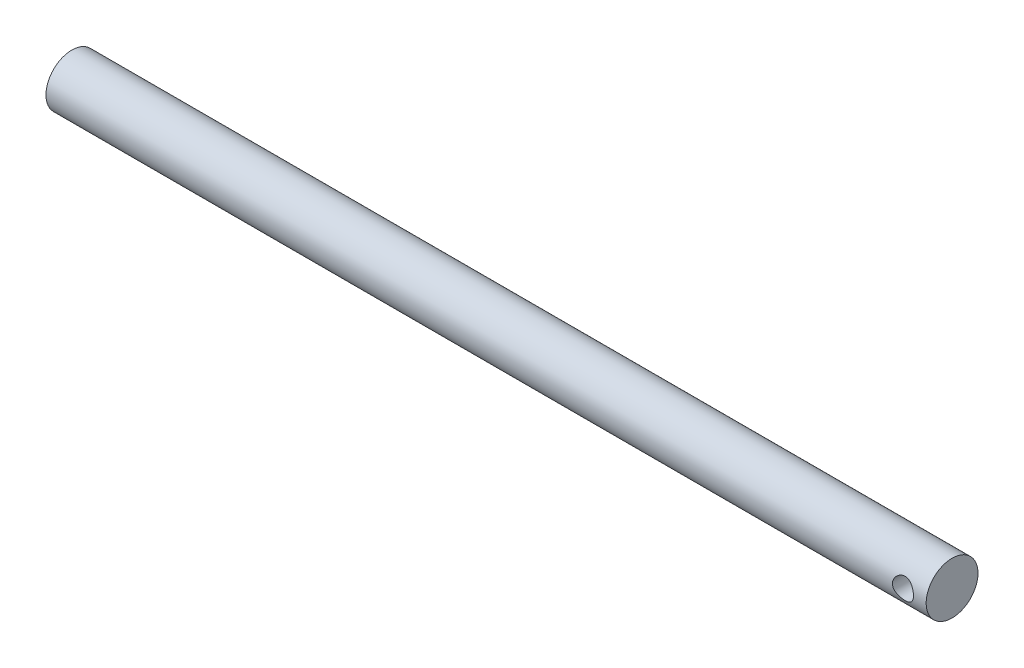
ISO-10303-21;
HEADER;
FILE_DESCRIPTION(('STEP AP214'),'2;1');
FILE_NAME('part.step','',(''),(''),'','','');
FILE_SCHEMA(('AUTOMOTIVE_DESIGN { 1 0 10303 214 1 1 1 1 }'));
ENDSEC;
DATA;
#1=APPLICATION_CONTEXT('core data for automotive mechanical design processes');
#2=APPLICATION_PROTOCOL_DEFINITION('international standard','automotive_design',2000,#1);
#3=PRODUCT_CONTEXT('',#1,'mechanical');
#4=PRODUCT('Part','Part','',(#3));
#5=PRODUCT_RELATED_PRODUCT_CATEGORY('part','',(#4));
#6=PRODUCT_DEFINITION_FORMATION('','',#4);
#7=PRODUCT_DEFINITION_CONTEXT('part definition',#1,'design');
#8=PRODUCT_DEFINITION('design','',#6,#7);
#9=PRODUCT_DEFINITION_SHAPE('','',#8);
#10=(LENGTH_UNIT() NAMED_UNIT(*) SI_UNIT(.MILLI.,.METRE.));
#11=(NAMED_UNIT(*) PLANE_ANGLE_UNIT() SI_UNIT($,.RADIAN.));
#12=(NAMED_UNIT(*) SI_UNIT($,.STERADIAN.) SOLID_ANGLE_UNIT());
#13=UNCERTAINTY_MEASURE_WITH_UNIT(LENGTH_MEASURE(1.E-05),#10,'distance_accuracy_value','');
#14=(GEOMETRIC_REPRESENTATION_CONTEXT(3) GLOBAL_UNCERTAINTY_ASSIGNED_CONTEXT((#13)) GLOBAL_UNIT_ASSIGNED_CONTEXT((#10,
#11,#12)) REPRESENTATION_CONTEXT('',''));
#15=CARTESIAN_POINT('',(0.,0.,0.));
#16=DIRECTION('',(0.,0.,1.));
#17=DIRECTION('',(1.,0.,0.));
#18=AXIS2_PLACEMENT_3D('',#15,#16,#17);
#19=CARTESIAN_POINT('',(336.55,0.,0.));
#20=DIRECTION('',(-1.,0.,0.));
#21=DIRECTION('',(0.,0.,1.));
#22=AXIS2_PLACEMENT_3D('',#19,#20,#21);
#23=CYLINDRICAL_SURFACE('',#22,9.90600000000003);
#24=CARTESIAN_POINT('',(331.6732,0.,-9.90600000000003));
#25=CARTESIAN_POINT('',(331.67319931171,0.107785756959739,-9.90599946720329));
#26=CARTESIAN_POINT('',(331.668851451565,0.215611870515692,-9.90423579157192));
#27=CARTESIAN_POINT('',(331.651500970418,0.430498103773549,-9.89722592009933));
#28=CARTESIAN_POINT('',(331.638492661224,0.537557673266086,-9.89197743543792));
#29=CARTESIAN_POINT('',(331.603912140248,0.750308446576703,-9.87811980477576));
#30=CARTESIAN_POINT('',(331.582321808404,0.855996263352754,-9.86950354871644));
#31=CARTESIAN_POINT('',(331.530801737637,1.06502491641378,-9.84914299845182));
#32=CARTESIAN_POINT('',(331.500868590722,1.16836477487382,-9.83739742602482));
#33=CARTESIAN_POINT('',(331.399197066726,1.47302518275353,-9.79799422248342));
#34=CARTESIAN_POINT('',(331.315430012255,1.66993495987736,-9.76610432932145));
#35=CARTESIAN_POINT('',(331.118658573489,2.04662803539722,-9.69417581812195));
#36=CARTESIAN_POINT('',(331.005663942857,2.22641701991603,-9.65413991947297));
#37=CARTESIAN_POINT('',(330.747907081554,2.57278567510446,-9.56780210647265));
#38=CARTESIAN_POINT('',(330.601969364299,2.73844075181738,-9.5213024412835));
#39=CARTESIAN_POINT('',(330.284827719943,3.04376186953679,-9.42814285118761));
#40=CARTESIAN_POINT('',(330.113611226987,3.18341490664399,-9.38148285791534));
#41=CARTESIAN_POINT('',(329.836688615126,3.3735969667962,-9.31410214580077));
#42=CARTESIAN_POINT('',(329.738636213966,3.43488760267198,-9.29161454179024));
#43=CARTESIAN_POINT('',(329.537284499471,3.54893572576803,-9.24865394929793));
#44=CARTESIAN_POINT('',(329.433987337233,3.60169667480695,-9.22818014483275));
#45=CARTESIAN_POINT('',(329.222792875433,3.69823447374518,-9.18991827098578));
#46=CARTESIAN_POINT('',(329.114895313452,3.74201081030794,-9.17213035507779));
#47=CARTESIAN_POINT('',(328.895306931957,3.82012571624854,-9.13987213388656));
#48=CARTESIAN_POINT('',(328.783618059778,3.85446905069886,-9.12540015417601));
#49=CARTESIAN_POINT('',(328.562446586724,3.91200940417058,-9.10087643989762));
#50=CARTESIAN_POINT('',(328.453097090242,3.93564475341129,-9.09065266580651));
#51=CARTESIAN_POINT('',(328.232565240865,3.97372079393312,-9.07407360908879));
#52=CARTESIAN_POINT('',(328.121383745134,3.98816566662676,-9.06771656726399));
#53=CARTESIAN_POINT('',(327.898067630786,4.00769981082608,-9.0591000111124));
#54=CARTESIAN_POINT('',(327.785933232388,4.01279118789037,-9.05683957460331));
#55=CARTESIAN_POINT('',(327.561630241576,4.01356148408144,-9.05649824006831));
#56=CARTESIAN_POINT('',(327.449461651079,4.00924085892323,-9.05841713968521));
#57=CARTESIAN_POINT('',(327.234073913478,3.99188878245661,-9.06607648204063));
#58=CARTESIAN_POINT('',(327.130791938782,3.9795069739982,-9.07153179745087));
#59=CARTESIAN_POINT('',(326.925714701338,3.94682140051344,-9.08579902222306));
#60=CARTESIAN_POINT('',(326.82391993843,3.9265150328825,-9.09461203430601));
#61=CARTESIAN_POINT('',(326.521855078954,3.85398295902639,-9.12570536256177));
#62=CARTESIAN_POINT('',(326.324723105224,3.79012932250168,-9.1526471296321));
#63=CARTESIAN_POINT('',(325.940069875939,3.63205557703205,-9.21652583125494));
#64=CARTESIAN_POINT('',(325.752831822534,3.53723456851028,-9.25365801715408));
#65=CARTESIAN_POINT('',(325.396195360218,3.32032204615302,-9.33368340821763));
#66=CARTESIAN_POINT('',(325.226803794326,3.19822012738186,-9.3765788089763));
#67=CARTESIAN_POINT('',(324.896537913437,2.91881447578817,-9.46744812035552));
#68=CARTESIAN_POINT('',(324.737410577375,2.7594842428423,-9.51555469917645));
#69=CARTESIAN_POINT('',(324.447564782867,2.41589686686986,-9.60853415127186));
#70=CARTESIAN_POINT('',(324.316852276572,2.23163451431844,-9.65340634571571));
#71=CARTESIAN_POINT('',(324.085177172906,1.83835332411109,-9.73603814067452));
#72=CARTESIAN_POINT('',(323.984887757494,1.62890032461179,-9.7736309388229));
#73=CARTESIAN_POINT('',(323.821572385602,1.19418590332827,-9.83620150008416));
#74=CARTESIAN_POINT('',(323.758526994021,0.968932795315464,-9.86118584169164));
#75=CARTESIAN_POINT('',(323.675058758445,0.523637120401855,-9.89451636722914));
#76=CARTESIAN_POINT('',(323.652290026871,0.304102530164374,-9.90377692692336));
#77=CARTESIAN_POINT('',(323.643074164198,-0.135825642678438,-9.90750841536815));
#78=CARTESIAN_POINT('',(323.656617316224,-0.356218979727653,-9.90198330069053));
#79=CARTESIAN_POINT('',(323.717929366506,-0.780868701339029,-9.87736123873587));
#80=CARTESIAN_POINT('',(323.764082986244,-0.985399579445305,-9.85890514422631));
#81=CARTESIAN_POINT('',(323.887092746533,-1.38361526293697,-9.81094774511991));
#82=CARTESIAN_POINT('',(323.963952813345,-1.57729867770586,-9.78144502808385));
#83=CARTESIAN_POINT('',(324.148705152098,-1.95503187616615,-9.71311883989844));
#84=CARTESIAN_POINT('',(324.257479337809,-2.13860199966074,-9.67403655250454));
#85=CARTESIAN_POINT('',(324.501996859352,-2.4855329922058,-9.59076865335602));
#86=CARTESIAN_POINT('',(324.637751153299,-2.64888560591668,-9.54658097108092));
#87=CARTESIAN_POINT('',(324.943144291843,-2.96235130163491,-9.45419481543783));
#88=CARTESIAN_POINT('',(325.114454759165,-3.1108197399243,-9.40592731612052));
#89=CARTESIAN_POINT('',(325.480388049249,-3.37732224960161,-9.31356406477619));
#90=CARTESIAN_POINT('',(325.675015125368,-3.49535075579504,-9.26946907652203));
#91=CARTESIAN_POINT('',(326.085309577407,-3.6985226275359,-9.19031240804444));
#92=CARTESIAN_POINT('',(326.301185065628,-3.78328951157574,-9.15535556038279));
#93=CARTESIAN_POINT('',(326.745995193962,-3.91459250383762,-9.09999862201889));
#94=CARTESIAN_POINT('',(326.974919712144,-3.96115782420201,-9.07958741006677));
#95=CARTESIAN_POINT('',(327.421192405149,-4.01191048954943,-9.05726822382088));
#96=CARTESIAN_POINT('',(327.638154205866,-4.01896190763851,-9.05411015743305));
#97=CARTESIAN_POINT('',(328.070022583305,-3.99804599712991,-9.06336561196016));
#98=CARTESIAN_POINT('',(328.284929432634,-3.97008338021767,-9.07577703775709));
#99=CARTESIAN_POINT('',(328.697408805736,-3.88229237250027,-9.11365805761341));
#100=CARTESIAN_POINT('',(328.895330520964,-3.82383844320487,-9.13856276592451));
#101=CARTESIAN_POINT('',(329.278625867465,-3.67802998473744,-9.19821214368756));
#102=CARTESIAN_POINT('',(329.463995996869,-3.59066742981208,-9.23295954532982));
#103=CARTESIAN_POINT('',(329.828685873396,-3.38364511919757,-9.31088962460299));
#104=CARTESIAN_POINT('',(330.007026344688,-3.26240218487819,-9.35444541834091));
#105=CARTESIAN_POINT('',(330.341714212323,-2.99338436919222,-9.44397149902089));
#106=CARTESIAN_POINT('',(330.498054642462,-2.84560111753074,-9.4899425444407));
#107=CARTESIAN_POINT('',(330.795175685481,-2.51572436591324,-9.58285586359443));
#108=CARTESIAN_POINT('',(330.934203459536,-2.33199210470509,-9.62965563356925));
#109=CARTESIAN_POINT('',(331.118071364304,-2.03981169714628,-9.69422721354448));
#110=CARTESIAN_POINT('',(331.175285378694,-1.93956495451881,-9.71482773338469));
#111=CARTESIAN_POINT('',(331.281022263686,-1.73415389893717,-9.75358601328541));
#112=CARTESIAN_POINT('',(331.329549124724,-1.62899187195536,-9.77174489395188));
#113=CARTESIAN_POINT('',(331.416688178499,-1.4163488961477,-9.80480349958568));
#114=CARTESIAN_POINT('',(331.455459489849,-1.30894108037842,-9.81975484973521));
#115=CARTESIAN_POINT('',(331.523780159846,-1.09088077880231,-9.84636319762273));
#116=CARTESIAN_POINT('',(331.553333863664,-0.9802298487895,-9.85802174733767));
#117=CARTESIAN_POINT('',(331.602856641398,-0.756783507401889,-9.87768520027674));
#118=CARTESIAN_POINT('',(331.622849665359,-0.643994198346997,-9.88569923073193));
#119=CARTESIAN_POINT('',(331.653119848625,-0.416970490890536,-9.89787218473156));
#120=CARTESIAN_POINT('',(331.663404295381,-0.302737241716623,-9.9020339997799));
#121=CARTESIAN_POINT('',(331.670253723842,-0.156928457497694,-9.90480674101653));
#122=CARTESIAN_POINT('',(331.671358314545,-0.12555560156652,-9.90525400445475));
#123=CARTESIAN_POINT('',(331.672831553009,-0.0627896384848647,-9.90585071160168));
#124=CARTESIAN_POINT('',(331.67320020049,-0.0313965313266424,-9.9060001551965));
#125=CARTESIAN_POINT('',(331.6732,0.,-9.90600000000003));
#126=B_SPLINE_CURVE_WITH_KNOTS('',3,(#24,#25,#26,#27,#28,#29,#30,#31,#32,#33,#34,#35,#36,#37,
#38,#39,#40,#41,#42,#43,#44,#45,#46,#47,#48,#49,#50,#51,#52,#53,#54,#55,#56,#57,#58,#59,#60,#61,
#62,#63,#64,#65,#66,#67,#68,#69,#70,#71,#72,#73,#74,#75,#76,#77,#78,#79,#80,#81,#82,#83,#84,#85,
#86,#87,#88,#89,#90,#91,#92,#93,#94,#95,#96,#97,#98,#99,#100,#101,#102,#103,#104,#105,#106,#107,
#108,#109,#110,#111,#112,#113,#114,#115,#116,#117,#118,#119,#120,#121,#122,#123,#124,#125),
.UNSPECIFIED.,.T.,.F.,(4,2,2,2,2,2,2,2,2,2,2,2,2,2,2,2,2,2,2,2,2,2,2,2,2,2,2,2,2,2,2,2,2,2,2,2,
2,2,2,2,2,2,2,2,2,2,2,2,2,2,4),(0.,0.323324929337709,0.646862428612577,0.971086704004783,
1.29544361781662,1.94130357069394,2.5869482682569,3.26089698176682,3.93518184422503,
4.28820918418762,4.64109288447482,4.99399674119123,5.34672199960586,5.68329821963634,
6.01972119708942,6.35606843332646,6.69239938449777,7.00451215592509,7.31672751863246,
7.94061881623197,8.5774173328727,9.21445914024528,9.90213248023218,10.5899497309485,
11.2920312001964,11.9937459769257,12.6530474041646,13.3121724233132,13.9407503393953,
14.5694086539382,15.217406563544,15.8656682008133,16.5578104588939,17.2500791686382,
17.9499718771549,18.649328888415,19.297266440613,19.9451168120598,20.5660079998404,
21.1870717072781,21.8442644699065,22.5016648633775,23.2032643238388,23.5546445570428,
23.9058629675241,24.2509148181572,24.5958037650251,24.9398241598601,25.2835861203166,
25.3777662576236,25.4719464309504),.UNSPECIFIED.);
#127=CARTESIAN_POINT('',(331.6732,0.,-9.90600000000003));
#128=VERTEX_POINT('',#127);
#129=EDGE_CURVE('E10',#128,#128,#126,.T.);
#130=ORIENTED_EDGE('',*,*,#129,.T.);
#131=EDGE_LOOP('',(#130));
#132=FACE_BOUND('',#131,.T.);
#133=CARTESIAN_POINT('',(331.6732,0.,9.90600000000003));
#134=CARTESIAN_POINT('',(331.67319931171,-0.107785756959739,9.90599946720329));
#135=CARTESIAN_POINT('',(331.668851451565,-0.215611870515692,9.90423579157192));
#136=CARTESIAN_POINT('',(331.651500970418,-0.430498103773549,9.89722592009933));
#137=CARTESIAN_POINT('',(331.638492661224,-0.537557673266086,9.89197743543792));
#138=CARTESIAN_POINT('',(331.603912140248,-0.750308446576703,9.87811980477576));
#139=CARTESIAN_POINT('',(331.582321808404,-0.855996263352754,9.86950354871644));
#140=CARTESIAN_POINT('',(331.530801737637,-1.06502491641378,9.84914299845182));
#141=CARTESIAN_POINT('',(331.500868590722,-1.16836477487382,9.83739742602482));
#142=CARTESIAN_POINT('',(331.399197066726,-1.47302518275353,9.79799422248342));
#143=CARTESIAN_POINT('',(331.315430012255,-1.66993495987736,9.76610432932145));
#144=CARTESIAN_POINT('',(331.118658573489,-2.04662803539722,9.69417581812195));
#145=CARTESIAN_POINT('',(331.005663942857,-2.22641701991603,9.65413991947297));
#146=CARTESIAN_POINT('',(330.747907081554,-2.57278567510446,9.56780210647265));
#147=CARTESIAN_POINT('',(330.601969364299,-2.73844075181738,9.5213024412835));
#148=CARTESIAN_POINT('',(330.284827719943,-3.04376186953679,9.42814285118761));
#149=CARTESIAN_POINT('',(330.113611226987,-3.18341490664399,9.38148285791534));
#150=CARTESIAN_POINT('',(329.836688615126,-3.3735969667962,9.31410214580077));
#151=CARTESIAN_POINT('',(329.738636213966,-3.43488760267198,9.29161454179024));
#152=CARTESIAN_POINT('',(329.537284499471,-3.54893572576803,9.24865394929793));
#153=CARTESIAN_POINT('',(329.433987337233,-3.60169667480695,9.22818014483275));
#154=CARTESIAN_POINT('',(329.222792875433,-3.69823447374518,9.18991827098578));
#155=CARTESIAN_POINT('',(329.114895313452,-3.74201081030794,9.17213035507779));
#156=CARTESIAN_POINT('',(328.895306931957,-3.82012571624854,9.13987213388656));
#157=CARTESIAN_POINT('',(328.783618059778,-3.85446905069886,9.12540015417601));
#158=CARTESIAN_POINT('',(328.562446586724,-3.91200940417058,9.10087643989762));
#159=CARTESIAN_POINT('',(328.453097090242,-3.93564475341129,9.09065266580651));
#160=CARTESIAN_POINT('',(328.232565240865,-3.97372079393312,9.07407360908879));
#161=CARTESIAN_POINT('',(328.121383745134,-3.98816566662676,9.06771656726399));
#162=CARTESIAN_POINT('',(327.898067630786,-4.00769981082608,9.0591000111124));
#163=CARTESIAN_POINT('',(327.785933232388,-4.01279118789037,9.05683957460331));
#164=CARTESIAN_POINT('',(327.561630241576,-4.01356148408144,9.05649824006831));
#165=CARTESIAN_POINT('',(327.449461651079,-4.00924085892323,9.05841713968521));
#166=CARTESIAN_POINT('',(327.234073913478,-3.99188878245661,9.06607648204063));
#167=CARTESIAN_POINT('',(327.130791938782,-3.9795069739982,9.07153179745087));
#168=CARTESIAN_POINT('',(326.925714701338,-3.94682140051344,9.08579902222306));
#169=CARTESIAN_POINT('',(326.82391993843,-3.9265150328825,9.09461203430601));
#170=CARTESIAN_POINT('',(326.521855078954,-3.85398295902639,9.12570536256177));
#171=CARTESIAN_POINT('',(326.324723105224,-3.79012932250168,9.1526471296321));
#172=CARTESIAN_POINT('',(325.940069875939,-3.63205557703205,9.21652583125494));
#173=CARTESIAN_POINT('',(325.752831822534,-3.53723456851028,9.25365801715408));
#174=CARTESIAN_POINT('',(325.396195360218,-3.32032204615302,9.33368340821763));
#175=CARTESIAN_POINT('',(325.226803794326,-3.19822012738186,9.3765788089763));
#176=CARTESIAN_POINT('',(324.896537913437,-2.91881447578817,9.46744812035552));
#177=CARTESIAN_POINT('',(324.737410577375,-2.7594842428423,9.51555469917645));
#178=CARTESIAN_POINT('',(324.447564782867,-2.41589686686986,9.60853415127186));
#179=CARTESIAN_POINT('',(324.316852276572,-2.23163451431844,9.65340634571571));
#180=CARTESIAN_POINT('',(324.085177172906,-1.83835332411109,9.73603814067452));
#181=CARTESIAN_POINT('',(323.984887757494,-1.62890032461179,9.7736309388229));
#182=CARTESIAN_POINT('',(323.821572385602,-1.19418590332827,9.83620150008416));
#183=CARTESIAN_POINT('',(323.758526994021,-0.968932795315464,9.86118584169164));
#184=CARTESIAN_POINT('',(323.675058758445,-0.523637120401855,9.89451636722914));
#185=CARTESIAN_POINT('',(323.652290026871,-0.304102530164374,9.90377692692336));
#186=CARTESIAN_POINT('',(323.643074164198,0.135825642678438,9.90750841536815));
#187=CARTESIAN_POINT('',(323.656617316224,0.356218979727653,9.90198330069053));
#188=CARTESIAN_POINT('',(323.717929366506,0.780868701339029,9.87736123873587));
#189=CARTESIAN_POINT('',(323.764082986244,0.985399579445305,9.85890514422631));
#190=CARTESIAN_POINT('',(323.887092746533,1.38361526293697,9.81094774511991));
#191=CARTESIAN_POINT('',(323.963952813345,1.57729867770586,9.78144502808385));
#192=CARTESIAN_POINT('',(324.148705152098,1.95503187616615,9.71311883989844));
#193=CARTESIAN_POINT('',(324.257479337809,2.13860199966074,9.67403655250454));
#194=CARTESIAN_POINT('',(324.501996859352,2.4855329922058,9.59076865335602));
#195=CARTESIAN_POINT('',(324.637751153299,2.64888560591668,9.54658097108092));
#196=CARTESIAN_POINT('',(324.943144291843,2.96235130163491,9.45419481543783));
#197=CARTESIAN_POINT('',(325.114454759165,3.1108197399243,9.40592731612052));
#198=CARTESIAN_POINT('',(325.480388049249,3.37732224960161,9.31356406477619));
#199=CARTESIAN_POINT('',(325.675015125368,3.49535075579504,9.26946907652203));
#200=CARTESIAN_POINT('',(326.085309577407,3.6985226275359,9.19031240804444));
#201=CARTESIAN_POINT('',(326.301185065628,3.78328951157574,9.15535556038279));
#202=CARTESIAN_POINT('',(326.745995193962,3.91459250383762,9.09999862201889));
#203=CARTESIAN_POINT('',(326.974919712144,3.96115782420201,9.07958741006677));
#204=CARTESIAN_POINT('',(327.421192405149,4.01191048954943,9.05726822382088));
#205=CARTESIAN_POINT('',(327.638154205866,4.01896190763851,9.05411015743305));
#206=CARTESIAN_POINT('',(328.070022583305,3.99804599712991,9.06336561196016));
#207=CARTESIAN_POINT('',(328.284929432634,3.97008338021767,9.07577703775709));
#208=CARTESIAN_POINT('',(328.697408805736,3.88229237250027,9.11365805761341));
#209=CARTESIAN_POINT('',(328.895330520964,3.82383844320487,9.13856276592451));
#210=CARTESIAN_POINT('',(329.278625867465,3.67802998473744,9.19821214368756));
#211=CARTESIAN_POINT('',(329.463995996869,3.59066742981208,9.23295954532982));
#212=CARTESIAN_POINT('',(329.828685873396,3.38364511919757,9.31088962460299));
#213=CARTESIAN_POINT('',(330.007026344688,3.26240218487819,9.35444541834091));
#214=CARTESIAN_POINT('',(330.341714212323,2.99338436919222,9.44397149902089));
#215=CARTESIAN_POINT('',(330.498054642462,2.84560111753074,9.4899425444407));
#216=CARTESIAN_POINT('',(330.795175685481,2.51572436591324,9.58285586359443));
#217=CARTESIAN_POINT('',(330.934203459536,2.33199210470509,9.62965563356925));
#218=CARTESIAN_POINT('',(331.118071364304,2.03981169714628,9.69422721354448));
#219=CARTESIAN_POINT('',(331.175285378694,1.93956495451881,9.71482773338469));
#220=CARTESIAN_POINT('',(331.281022263686,1.73415389893717,9.75358601328541));
#221=CARTESIAN_POINT('',(331.329549124724,1.62899187195536,9.77174489395188));
#222=CARTESIAN_POINT('',(331.416688178499,1.4163488961477,9.80480349958568));
#223=CARTESIAN_POINT('',(331.455459489849,1.30894108037842,9.81975484973521));
#224=CARTESIAN_POINT('',(331.523780159846,1.09088077880231,9.84636319762273));
#225=CARTESIAN_POINT('',(331.553333863664,0.9802298487895,9.85802174733767));
#226=CARTESIAN_POINT('',(331.602856641398,0.756783507401889,9.87768520027674));
#227=CARTESIAN_POINT('',(331.622849665359,0.643994198346997,9.88569923073193));
#228=CARTESIAN_POINT('',(331.653119848625,0.416970490890536,9.89787218473156));
#229=CARTESIAN_POINT('',(331.663404295381,0.302737241716623,9.9020339997799));
#230=CARTESIAN_POINT('',(331.670253723842,0.156928457497694,9.90480674101653));
#231=CARTESIAN_POINT('',(331.671358314545,0.12555560156652,9.90525400445475));
#232=CARTESIAN_POINT('',(331.672831553009,0.0627896384848647,9.90585071160168));
#233=CARTESIAN_POINT('',(331.67320020049,0.0313965313266424,9.9060001551965));
#234=CARTESIAN_POINT('',(331.6732,0.,9.90600000000003));
#235=B_SPLINE_CURVE_WITH_KNOTS('',3,(#133,#134,#135,#136,#137,#138,#139,#140,#141,#142,#143,
#144,#145,#146,#147,#148,#149,#150,#151,#152,#153,#154,#155,#156,#157,#158,#159,#160,#161,#162,
#163,#164,#165,#166,#167,#168,#169,#170,#171,#172,#173,#174,#175,#176,#177,#178,#179,#180,#181,
#182,#183,#184,#185,#186,#187,#188,#189,#190,#191,#192,#193,#194,#195,#196,#197,#198,#199,#200,
#201,#202,#203,#204,#205,#206,#207,#208,#209,#210,#211,#212,#213,#214,#215,#216,#217,#218,#219,
#220,#221,#222,#223,#224,#225,#226,#227,#228,#229,#230,#231,#232,#233,#234),.UNSPECIFIED.,.T.,
.F.,(4,2,2,2,2,2,2,2,2,2,2,2,2,2,2,2,2,2,2,2,2,2,2,2,2,2,2,2,2,2,2,2,2,2,2,2,2,2,2,2,2,2,2,2,2,
2,2,2,2,2,4),(0.,0.323324929337709,0.646862428612577,0.971086704004783,1.29544361781662,
1.94130357069394,2.5869482682569,3.26089698176682,3.93518184422503,4.28820918418762,
4.64109288447482,4.99399674119123,5.34672199960586,5.68329821963634,6.01972119708942,
6.35606843332646,6.69239938449777,7.00451215592509,7.31672751863246,7.94061881623197,
8.5774173328727,9.21445914024528,9.90213248023218,10.5899497309485,11.2920312001964,
11.9937459769257,12.6530474041646,13.3121724233132,13.9407503393953,14.5694086539382,
15.217406563544,15.8656682008133,16.5578104588939,17.2500791686382,17.9499718771549,
18.649328888415,19.297266440613,19.9451168120598,20.5660079998404,21.1870717072781,
21.8442644699065,22.5016648633775,23.2032643238388,23.5546445570428,23.9058629675241,
24.2509148181572,24.5958037650251,24.9398241598601,25.2835861203166,25.3777662576236,
25.4719464309504),.UNSPECIFIED.);
#236=CARTESIAN_POINT('',(331.6732,0.,9.90600000000003));
#237=VERTEX_POINT('',#236);
#238=EDGE_CURVE('E41',#237,#237,#235,.T.);
#239=ORIENTED_EDGE('',*,*,#238,.T.);
#240=EDGE_LOOP('',(#239));
#241=FACE_BOUND('',#240,.T.);
#242=CARTESIAN_POINT('',(336.55,0.,0.));
#243=DIRECTION('',(1.,0.,0.));
#244=DIRECTION('',(0.,0.,-1.));
#245=AXIS2_PLACEMENT_3D('',#242,#243,#244);
#246=CIRCLE('',#245,9.90600000000003);
#247=CARTESIAN_POINT('',(336.55,0.,-9.90600000000003));
#248=VERTEX_POINT('',#247);
#249=EDGE_CURVE('E45',#248,#248,#246,.T.);
#250=ORIENTED_EDGE('',*,*,#249,.F.);
#251=EDGE_LOOP('',(#250));
#252=FACE_BOUND('',#251,.T.);
#253=CARTESIAN_POINT('',(0.,0.,0.));
#254=DIRECTION('',(1.,0.,0.));
#255=DIRECTION('',(0.,0.,-1.));
#256=AXIS2_PLACEMENT_3D('',#253,#254,#255);
#257=CIRCLE('',#256,9.90600000000003);
#258=CARTESIAN_POINT('',(0.,0.,-9.90600000000003));
#259=VERTEX_POINT('',#258);
#260=EDGE_CURVE('E49',#259,#259,#257,.T.);
#261=ORIENTED_EDGE('',*,*,#260,.T.);
#262=EDGE_LOOP('',(#261));
#263=FACE_BOUND('',#262,.T.);
#264=ADVANCED_FACE('F31',(#132,#241,#252,#263),#23,.T.);
#265=CARTESIAN_POINT('',(336.55,0.,0.));
#266=DIRECTION('',(1.,0.,0.));
#267=DIRECTION('',(0.,0.,-1.));
#268=AXIS2_PLACEMENT_3D('',#265,#266,#267);
#269=PLANE('',#268);
#270=ORIENTED_EDGE('',*,*,#249,.T.);
#271=EDGE_LOOP('',(#270));
#272=FACE_BOUND('',#271,.T.);
#273=ADVANCED_FACE('F60',(#272),#269,.T.);
#274=CARTESIAN_POINT('',(0.,0.,0.));
#275=DIRECTION('',(1.,0.,0.));
#276=DIRECTION('',(0.,0.,-1.));
#277=AXIS2_PLACEMENT_3D('',#274,#275,#276);
#278=PLANE('',#277);
#279=ORIENTED_EDGE('',*,*,#260,.F.);
#280=EDGE_LOOP('',(#279));
#281=FACE_BOUND('',#280,.T.);
#282=ADVANCED_FACE('F58',(#281),#278,.F.);
#283=CARTESIAN_POINT('',(327.66,0.,-9.90600000000003));
#284=DIRECTION('',(0.,0.,1.));
#285=DIRECTION('',(1.,0.,0.));
#286=AXIS2_PLACEMENT_3D('',#283,#284,#285);
#287=CYLINDRICAL_SURFACE('',#286,4.01320000000001);
#288=ORIENTED_EDGE('',*,*,#238,.F.);
#289=EDGE_LOOP('',(#288));
#290=FACE_BOUND('',#289,.T.);
#291=ORIENTED_EDGE('',*,*,#129,.F.);
#292=EDGE_LOOP('',(#291));
#293=FACE_BOUND('',#292,.T.);
#294=ADVANCED_FACE('F54',(#290,#293),#287,.F.);
#295=CLOSED_SHELL('',(#264,#273,#282,#294));
#296=MANIFOLD_SOLID_BREP('B2',#295);
#297=ADVANCED_BREP_SHAPE_REPRESENTATION('',(#18,#296),#14);
#298=SHAPE_DEFINITION_REPRESENTATION(#9,#297);
ENDSEC;
END-ISO-10303-21;
